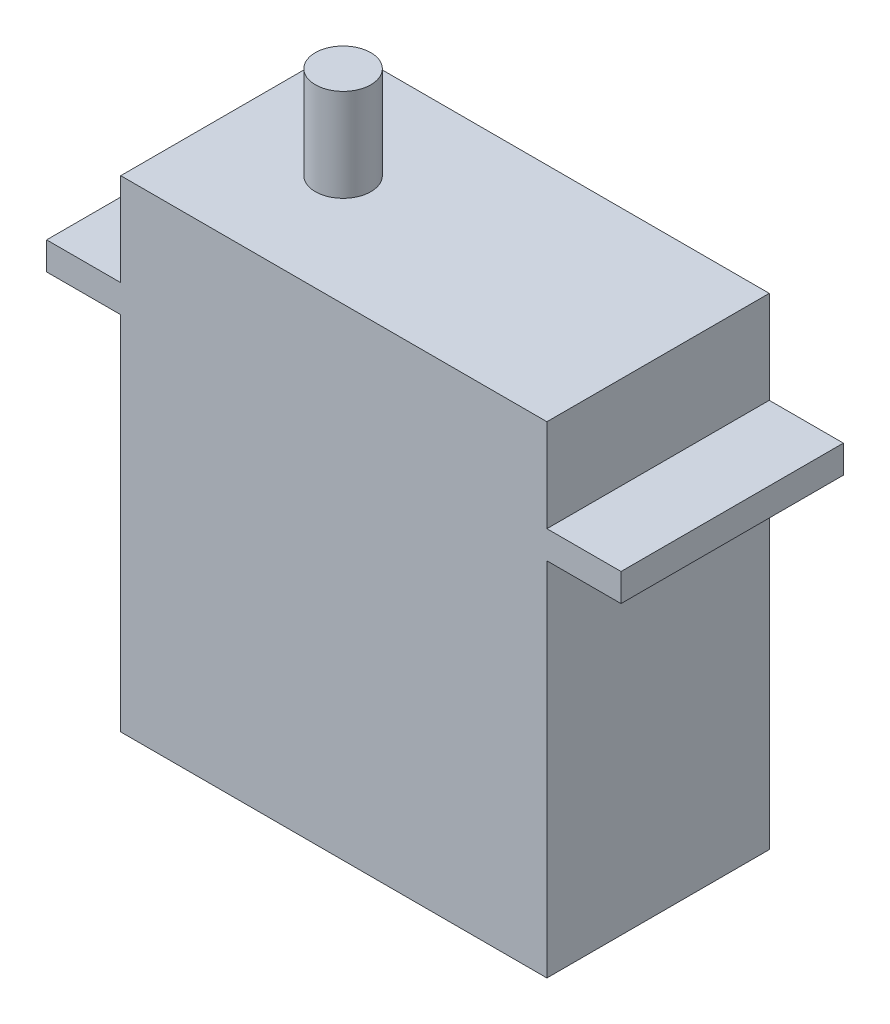
ISO-10303-21;
HEADER;
FILE_DESCRIPTION(('STEP AP214'),'2;1');
FILE_NAME('part.step','',(''),(''),'','','');
FILE_SCHEMA(('AUTOMOTIVE_DESIGN { 1 0 10303 214 1 1 1 1 }'));
ENDSEC;
DATA;
#1=APPLICATION_CONTEXT('core data for automotive mechanical design processes');
#2=APPLICATION_PROTOCOL_DEFINITION('international standard','automotive_design',2000,#1);
#3=PRODUCT_CONTEXT('',#1,'mechanical');
#4=PRODUCT('Part','Part','',(#3));
#5=PRODUCT_RELATED_PRODUCT_CATEGORY('part','',(#4));
#6=PRODUCT_DEFINITION_FORMATION('','',#4);
#7=PRODUCT_DEFINITION_CONTEXT('part definition',#1,'design');
#8=PRODUCT_DEFINITION('design','',#6,#7);
#9=PRODUCT_DEFINITION_SHAPE('','',#8);
#10=(LENGTH_UNIT() NAMED_UNIT(*) SI_UNIT(.MILLI.,.METRE.));
#11=(NAMED_UNIT(*) PLANE_ANGLE_UNIT() SI_UNIT($,.RADIAN.));
#12=(NAMED_UNIT(*) SI_UNIT($,.STERADIAN.) SOLID_ANGLE_UNIT());
#13=UNCERTAINTY_MEASURE_WITH_UNIT(LENGTH_MEASURE(1.E-05),#10,'distance_accuracy_value','');
#14=(GEOMETRIC_REPRESENTATION_CONTEXT(3) GLOBAL_UNCERTAINTY_ASSIGNED_CONTEXT((#13)) GLOBAL_UNIT_ASSIGNED_CONTEXT((#10,
#11,#12)) REPRESENTATION_CONTEXT('',''));
#15=CARTESIAN_POINT('',(0.,0.,0.));
#16=DIRECTION('',(0.,0.,1.));
#17=DIRECTION('',(1.,0.,0.));
#18=AXIS2_PLACEMENT_3D('',#15,#16,#17);
#19=CARTESIAN_POINT('',(-11.5,26.,-6.));
#20=DIRECTION('',(1.,0.,0.));
#21=DIRECTION('',(0.,0.,-1.));
#22=AXIS2_PLACEMENT_3D('',#19,#20,#21);
#23=PLANE('',#22);
#24=DIRECTION('',(0.,-1.,0.));
#25=VECTOR('',#24,1.);
#26=CARTESIAN_POINT('',(-11.5,26.,6.));
#27=LINE('',#26,#25);
#28=CARTESIAN_POINT('',(-11.5,19.5,6.));
#29=VERTEX_POINT('',#28);
#30=CARTESIAN_POINT('',(-11.5,0.,6.));
#31=VERTEX_POINT('',#30);
#32=EDGE_CURVE('E208',#29,#31,#27,.T.);
#33=ORIENTED_EDGE('',*,*,#32,.F.);
#34=DIRECTION('',(0.,0.,-1.));
#35=VECTOR('',#34,1.);
#36=CARTESIAN_POINT('',(-11.5,19.5,6.));
#37=LINE('',#36,#35);
#38=CARTESIAN_POINT('',(-11.5,19.5,-6.));
#39=VERTEX_POINT('',#38);
#40=EDGE_CURVE('E141',#29,#39,#37,.T.);
#41=ORIENTED_EDGE('',*,*,#40,.T.);
#42=DIRECTION('',(0.,-1.,0.));
#43=VECTOR('',#42,1.);
#44=CARTESIAN_POINT('',(-11.5,26.,-6.));
#45=LINE('',#44,#43);
#46=CARTESIAN_POINT('',(-11.5,0.,-6.));
#47=VERTEX_POINT('',#46);
#48=EDGE_CURVE('E209',#39,#47,#45,.T.);
#49=ORIENTED_EDGE('',*,*,#48,.T.);
#50=DIRECTION('',(0.,0.,1.));
#51=VECTOR('',#50,1.);
#52=CARTESIAN_POINT('',(-11.5,0.,-6.));
#53=LINE('',#52,#51);
#54=EDGE_CURVE('E202',#47,#31,#53,.T.);
#55=ORIENTED_EDGE('',*,*,#54,.T.);
#56=EDGE_LOOP('',(#33,#41,#49,#55));
#57=FACE_BOUND('',#56,.T.);
#58=ADVANCED_FACE('F33',(#57),#23,.F.);
#59=CARTESIAN_POINT('',(11.5,26.,-6.));
#60=DIRECTION('',(-1.,0.,0.));
#61=DIRECTION('',(0.,0.,1.));
#62=AXIS2_PLACEMENT_3D('',#59,#60,#61);
#63=PLANE('',#62);
#64=DIRECTION('',(0.,0.,1.));
#65=VECTOR('',#64,1.);
#66=CARTESIAN_POINT('',(11.5,21.,6.));
#67=LINE('',#66,#65);
#68=CARTESIAN_POINT('',(11.5,21.,-6.));
#69=VERTEX_POINT('',#68);
#70=CARTESIAN_POINT('',(11.5,21.,6.));
#71=VERTEX_POINT('',#70);
#72=EDGE_CURVE('E164',#69,#71,#67,.T.);
#73=ORIENTED_EDGE('',*,*,#72,.F.);
#74=DIRECTION('',(0.,-1.,0.));
#75=VECTOR('',#74,1.);
#76=CARTESIAN_POINT('',(11.5,26.,-6.));
#77=LINE('',#76,#75);
#78=CARTESIAN_POINT('',(11.5,26.,-6.));
#79=VERTEX_POINT('',#78);
#80=EDGE_CURVE('E11',#79,#69,#77,.T.);
#81=ORIENTED_EDGE('',*,*,#80,.F.);
#82=DIRECTION('',(0.,0.,-1.));
#83=VECTOR('',#82,1.);
#84=CARTESIAN_POINT('',(11.5,26.,-6.));
#85=LINE('',#84,#83);
#86=CARTESIAN_POINT('',(11.5,26.,6.));
#87=VERTEX_POINT('',#86);
#88=EDGE_CURVE('E186',#87,#79,#85,.T.);
#89=ORIENTED_EDGE('',*,*,#88,.F.);
#90=DIRECTION('',(0.,-1.,0.));
#91=VECTOR('',#90,1.);
#92=CARTESIAN_POINT('',(11.5,26.,6.));
#93=LINE('',#92,#91);
#94=EDGE_CURVE('E206',#87,#71,#93,.T.);
#95=ORIENTED_EDGE('',*,*,#94,.T.);
#96=EDGE_LOOP('',(#73,#81,#89,#95));
#97=FACE_BOUND('',#96,.T.);
#98=ADVANCED_FACE('F35',(#97),#63,.F.);
#99=DIRECTION('',(0.,0.,-1.));
#100=VECTOR('',#99,1.);
#101=CARTESIAN_POINT('',(11.5,19.5,6.));
#102=LINE('',#101,#100);
#103=CARTESIAN_POINT('',(11.5,19.5,6.));
#104=VERTEX_POINT('',#103);
#105=CARTESIAN_POINT('',(11.5,19.5,-6.));
#106=VERTEX_POINT('',#105);
#107=EDGE_CURVE('E56',#104,#106,#102,.T.);
#108=ORIENTED_EDGE('',*,*,#107,.F.);
#109=CARTESIAN_POINT('',(11.5,0.,6.));
#110=VERTEX_POINT('',#109);
#111=EDGE_CURVE('E196',#104,#110,#93,.T.);
#112=ORIENTED_EDGE('',*,*,#111,.T.);
#113=DIRECTION('',(0.,0.,-1.));
#114=VECTOR('',#113,1.);
#115=CARTESIAN_POINT('',(11.5,0.,-6.));
#116=LINE('',#115,#114);
#117=CARTESIAN_POINT('',(11.5,0.,-6.));
#118=VERTEX_POINT('',#117);
#119=EDGE_CURVE('E185',#110,#118,#116,.T.);
#120=ORIENTED_EDGE('',*,*,#119,.T.);
#121=EDGE_CURVE('E41',#106,#118,#77,.T.);
#122=ORIENTED_EDGE('',*,*,#121,.F.);
#123=EDGE_LOOP('',(#108,#112,#120,#122));
#124=FACE_BOUND('',#123,.T.);
#125=ADVANCED_FACE('F263',(#124),#63,.F.);
#126=CARTESIAN_POINT('',(-11.5,26.,-6.));
#127=DIRECTION('',(0.,0.,1.));
#128=DIRECTION('',(1.,0.,0.));
#129=AXIS2_PLACEMENT_3D('',#126,#127,#128);
#130=PLANE('',#129);
#131=DIRECTION('',(-1.,0.,0.));
#132=VECTOR('',#131,1.);
#133=CARTESIAN_POINT('',(-11.5,0.,-6.));
#134=LINE('',#133,#132);
#135=EDGE_CURVE('E199',#118,#47,#134,.T.);
#136=ORIENTED_EDGE('',*,*,#135,.T.);
#137=ORIENTED_EDGE('',*,*,#48,.F.);
#138=DIRECTION('',(1.,0.,0.));
#139=VECTOR('',#138,1.);
#140=CARTESIAN_POINT('',(-15.5,19.5,-6.));
#141=LINE('',#140,#139);
#142=CARTESIAN_POINT('',(-15.5,19.5,-6.));
#143=VERTEX_POINT('',#142);
#144=EDGE_CURVE('E157',#143,#39,#141,.T.);
#145=ORIENTED_EDGE('',*,*,#144,.F.);
#146=DIRECTION('',(0.,1.,0.));
#147=VECTOR('',#146,1.);
#148=CARTESIAN_POINT('',(-15.5,21.,-6.));
#149=LINE('',#148,#147);
#150=CARTESIAN_POINT('',(-15.5,21.,-6.));
#151=VERTEX_POINT('',#150);
#152=EDGE_CURVE('E144',#143,#151,#149,.T.);
#153=ORIENTED_EDGE('',*,*,#152,.T.);
#154=DIRECTION('',(1.,0.,0.));
#155=VECTOR('',#154,1.);
#156=CARTESIAN_POINT('',(-15.5,21.,-6.));
#157=LINE('',#156,#155);
#158=CARTESIAN_POINT('',(-11.5,21.,-6.));
#159=VERTEX_POINT('',#158);
#160=EDGE_CURVE('E131',#151,#159,#157,.T.);
#161=ORIENTED_EDGE('',*,*,#160,.T.);
#162=CARTESIAN_POINT('',(-11.5,26.,-6.));
#163=VERTEX_POINT('',#162);
#164=EDGE_CURVE('E210',#163,#159,#45,.T.);
#165=ORIENTED_EDGE('',*,*,#164,.F.);
#166=DIRECTION('',(-1.,0.,0.));
#167=VECTOR('',#166,1.);
#168=CARTESIAN_POINT('',(-11.5,26.,-6.));
#169=LINE('',#168,#167);
#170=EDGE_CURVE('E189',#79,#163,#169,.T.);
#171=ORIENTED_EDGE('',*,*,#170,.F.);
#172=ORIENTED_EDGE('',*,*,#80,.T.);
#173=DIRECTION('',(-1.,0.,0.));
#174=VECTOR('',#173,1.);
#175=CARTESIAN_POINT('',(15.5,21.,-6.));
#176=LINE('',#175,#174);
#177=CARTESIAN_POINT('',(15.5,21.,-6.));
#178=VERTEX_POINT('',#177);
#179=EDGE_CURVE('E176',#178,#69,#176,.T.);
#180=ORIENTED_EDGE('',*,*,#179,.F.);
#181=DIRECTION('',(0.,1.,0.));
#182=VECTOR('',#181,1.);
#183=CARTESIAN_POINT('',(15.5,21.,-6.));
#184=LINE('',#183,#182);
#185=CARTESIAN_POINT('',(15.5,19.5,-6.));
#186=VERTEX_POINT('',#185);
#187=EDGE_CURVE('E166',#186,#178,#184,.T.);
#188=ORIENTED_EDGE('',*,*,#187,.F.);
#189=DIRECTION('',(-1.,0.,0.));
#190=VECTOR('',#189,1.);
#191=CARTESIAN_POINT('',(15.5,19.5,-6.));
#192=LINE('',#191,#190);
#193=EDGE_CURVE('E179',#186,#106,#192,.T.);
#194=ORIENTED_EDGE('',*,*,#193,.T.);
#195=ORIENTED_EDGE('',*,*,#121,.T.);
#196=EDGE_LOOP('',(#136,#137,#145,#153,#161,#165,#171,#172,#180,#188,#194,#195));
#197=FACE_BOUND('',#196,.T.);
#198=ADVANCED_FACE('F223',(#197),#130,.F.);
#199=ORIENTED_EDGE('',*,*,#164,.T.);
#200=DIRECTION('',(0.,0.,1.));
#201=VECTOR('',#200,1.);
#202=CARTESIAN_POINT('',(-11.5,21.,6.));
#203=LINE('',#202,#201);
#204=CARTESIAN_POINT('',(-11.5,21.,6.));
#205=VERTEX_POINT('',#204);
#206=EDGE_CURVE('E151',#159,#205,#203,.T.);
#207=ORIENTED_EDGE('',*,*,#206,.T.);
#208=CARTESIAN_POINT('',(-11.5,26.,6.));
#209=VERTEX_POINT('',#208);
#210=EDGE_CURVE('E130',#209,#205,#27,.T.);
#211=ORIENTED_EDGE('',*,*,#210,.F.);
#212=DIRECTION('',(0.,0.,1.));
#213=VECTOR('',#212,1.);
#214=CARTESIAN_POINT('',(-11.5,26.,-6.));
#215=LINE('',#214,#213);
#216=EDGE_CURVE('E192',#163,#209,#215,.T.);
#217=ORIENTED_EDGE('',*,*,#216,.F.);
#218=EDGE_LOOP('',(#199,#207,#211,#217));
#219=FACE_BOUND('',#218,.T.);
#220=ADVANCED_FACE('F230',(#219),#23,.F.);
#221=CARTESIAN_POINT('',(-11.5,26.,6.));
#222=DIRECTION('',(0.,0.,-1.));
#223=DIRECTION('',(-1.,0.,0.));
#224=AXIS2_PLACEMENT_3D('',#221,#222,#223);
#225=PLANE('',#224);
#226=DIRECTION('',(1.,0.,0.));
#227=VECTOR('',#226,1.);
#228=CARTESIAN_POINT('',(-11.5,0.,6.));
#229=LINE('',#228,#227);
#230=EDGE_CURVE('E190',#31,#110,#229,.T.);
#231=ORIENTED_EDGE('',*,*,#230,.T.);
#232=ORIENTED_EDGE('',*,*,#111,.F.);
#233=DIRECTION('',(-1.,0.,0.));
#234=VECTOR('',#233,1.);
#235=CARTESIAN_POINT('',(15.5,19.5,6.));
#236=LINE('',#235,#234);
#237=CARTESIAN_POINT('',(15.5,19.5,6.));
#238=VERTEX_POINT('',#237);
#239=EDGE_CURVE('E182',#238,#104,#236,.T.);
#240=ORIENTED_EDGE('',*,*,#239,.F.);
#241=DIRECTION('',(0.,-1.,0.));
#242=VECTOR('',#241,1.);
#243=CARTESIAN_POINT('',(15.5,21.,6.));
#244=LINE('',#243,#242);
#245=CARTESIAN_POINT('',(15.5,21.,6.));
#246=VERTEX_POINT('',#245);
#247=EDGE_CURVE('E160',#246,#238,#244,.T.);
#248=ORIENTED_EDGE('',*,*,#247,.F.);
#249=DIRECTION('',(-1.,0.,0.));
#250=VECTOR('',#249,1.);
#251=CARTESIAN_POINT('',(15.5,21.,6.));
#252=LINE('',#251,#250);
#253=EDGE_CURVE('E170',#246,#71,#252,.T.);
#254=ORIENTED_EDGE('',*,*,#253,.T.);
#255=ORIENTED_EDGE('',*,*,#94,.F.);
#256=DIRECTION('',(1.,0.,0.));
#257=VECTOR('',#256,1.);
#258=CARTESIAN_POINT('',(-11.5,26.,6.));
#259=LINE('',#258,#257);
#260=EDGE_CURVE('E194',#209,#87,#259,.T.);
#261=ORIENTED_EDGE('',*,*,#260,.F.);
#262=ORIENTED_EDGE('',*,*,#210,.T.);
#263=DIRECTION('',(1.,0.,0.));
#264=VECTOR('',#263,1.);
#265=CARTESIAN_POINT('',(-15.5,21.,6.));
#266=LINE('',#265,#264);
#267=CARTESIAN_POINT('',(-15.5,21.,6.));
#268=VERTEX_POINT('',#267);
#269=EDGE_CURVE('E48',#268,#205,#266,.T.);
#270=ORIENTED_EDGE('',*,*,#269,.F.);
#271=DIRECTION('',(0.,-1.,0.));
#272=VECTOR('',#271,1.);
#273=CARTESIAN_POINT('',(-15.5,21.,6.));
#274=LINE('',#273,#272);
#275=CARTESIAN_POINT('',(-15.5,19.5,6.));
#276=VERTEX_POINT('',#275);
#277=EDGE_CURVE('E126',#268,#276,#274,.T.);
#278=ORIENTED_EDGE('',*,*,#277,.T.);
#279=DIRECTION('',(1.,0.,0.));
#280=VECTOR('',#279,1.);
#281=CARTESIAN_POINT('',(-15.5,19.5,6.));
#282=LINE('',#281,#280);
#283=EDGE_CURVE('E150',#276,#29,#282,.T.);
#284=ORIENTED_EDGE('',*,*,#283,.T.);
#285=ORIENTED_EDGE('',*,*,#32,.T.);
#286=EDGE_LOOP('',(#231,#232,#240,#248,#254,#255,#261,#262,#270,#278,#284,#285));
#287=FACE_BOUND('',#286,.T.);
#288=ADVANCED_FACE('F125',(#287),#225,.F.);
#289=CARTESIAN_POINT('',(0.,26.,0.));
#290=DIRECTION('',(0.,1.,0.));
#291=DIRECTION('',(0.,0.,1.));
#292=AXIS2_PLACEMENT_3D('',#289,#290,#291);
#293=PLANE('',#292);
#294=CARTESIAN_POINT('',(-5.5,26.,0.));
#295=DIRECTION('',(0.,1.,0.));
#296=DIRECTION('',(0.,0.,1.));
#297=AXIS2_PLACEMENT_3D('',#294,#295,#296);
#298=CIRCLE('',#297,1.5);
#299=CARTESIAN_POINT('',(-5.5,26.,1.5));
#300=VERTEX_POINT('',#299);
#301=EDGE_CURVE('E391',#300,#300,#298,.T.);
#302=ORIENTED_EDGE('',*,*,#301,.F.);
#303=EDGE_LOOP('',(#302));
#304=FACE_BOUND('',#303,.T.);
#305=ORIENTED_EDGE('',*,*,#88,.T.);
#306=ORIENTED_EDGE('',*,*,#170,.T.);
#307=ORIENTED_EDGE('',*,*,#216,.T.);
#308=ORIENTED_EDGE('',*,*,#260,.T.);
#309=EDGE_LOOP('',(#305,#306,#307,#308));
#310=FACE_BOUND('',#309,.T.);
#311=ADVANCED_FACE('F234',(#304,#310),#293,.T.);
#312=CARTESIAN_POINT('',(0.,0.,0.));
#313=DIRECTION('',(0.,1.,0.));
#314=DIRECTION('',(0.,0.,1.));
#315=AXIS2_PLACEMENT_3D('',#312,#313,#314);
#316=PLANE('',#315);
#317=ORIENTED_EDGE('',*,*,#119,.F.);
#318=ORIENTED_EDGE('',*,*,#230,.F.);
#319=ORIENTED_EDGE('',*,*,#54,.F.);
#320=ORIENTED_EDGE('',*,*,#135,.F.);
#321=EDGE_LOOP('',(#317,#318,#319,#320));
#322=FACE_BOUND('',#321,.T.);
#323=ADVANCED_FACE('F226',(#322),#316,.F.);
#324=CARTESIAN_POINT('',(15.5,19.5,6.));
#325=DIRECTION('',(0.,1.,0.));
#326=DIRECTION('',(0.,0.,1.));
#327=AXIS2_PLACEMENT_3D('',#324,#325,#326);
#328=PLANE('',#327);
#329=ORIENTED_EDGE('',*,*,#107,.T.);
#330=ORIENTED_EDGE('',*,*,#193,.F.);
#331=DIRECTION('',(0.,0.,-1.));
#332=VECTOR('',#331,1.);
#333=CARTESIAN_POINT('',(15.5,19.5,6.));
#334=LINE('',#333,#332);
#335=EDGE_CURVE('E163',#238,#186,#334,.T.);
#336=ORIENTED_EDGE('',*,*,#335,.F.);
#337=ORIENTED_EDGE('',*,*,#239,.T.);
#338=EDGE_LOOP('',(#329,#330,#336,#337));
#339=FACE_BOUND('',#338,.T.);
#340=ADVANCED_FACE('F248',(#339),#328,.F.);
#341=CARTESIAN_POINT('',(15.5,21.,6.));
#342=DIRECTION('',(0.,-1.,0.));
#343=DIRECTION('',(0.,0.,-1.));
#344=AXIS2_PLACEMENT_3D('',#341,#342,#343);
#345=PLANE('',#344);
#346=ORIENTED_EDGE('',*,*,#72,.T.);
#347=ORIENTED_EDGE('',*,*,#253,.F.);
#348=DIRECTION('',(0.,0.,1.));
#349=VECTOR('',#348,1.);
#350=CARTESIAN_POINT('',(15.5,21.,6.));
#351=LINE('',#350,#349);
#352=EDGE_CURVE('E168',#178,#246,#351,.T.);
#353=ORIENTED_EDGE('',*,*,#352,.F.);
#354=ORIENTED_EDGE('',*,*,#179,.T.);
#355=EDGE_LOOP('',(#346,#347,#353,#354));
#356=FACE_BOUND('',#355,.T.);
#357=ADVANCED_FACE('F241',(#356),#345,.F.);
#358=CARTESIAN_POINT('',(15.5,0.,0.));
#359=DIRECTION('',(1.,0.,0.));
#360=DIRECTION('',(0.,0.,-1.));
#361=AXIS2_PLACEMENT_3D('',#358,#359,#360);
#362=PLANE('',#361);
#363=ORIENTED_EDGE('',*,*,#247,.T.);
#364=ORIENTED_EDGE('',*,*,#335,.T.);
#365=ORIENTED_EDGE('',*,*,#187,.T.);
#366=ORIENTED_EDGE('',*,*,#352,.T.);
#367=EDGE_LOOP('',(#363,#364,#365,#366));
#368=FACE_BOUND('',#367,.T.);
#369=ADVANCED_FACE('F245',(#368),#362,.T.);
#370=CARTESIAN_POINT('',(-15.5,21.,6.));
#371=DIRECTION('',(0.,1.,0.));
#372=DIRECTION('',(0.,0.,1.));
#373=AXIS2_PLACEMENT_3D('',#370,#371,#372);
#374=PLANE('',#373);
#375=ORIENTED_EDGE('',*,*,#206,.F.);
#376=ORIENTED_EDGE('',*,*,#160,.F.);
#377=DIRECTION('',(0.,0.,1.));
#378=VECTOR('',#377,1.);
#379=CARTESIAN_POINT('',(-15.5,21.,6.));
#380=LINE('',#379,#378);
#381=EDGE_CURVE('E137',#151,#268,#380,.T.);
#382=ORIENTED_EDGE('',*,*,#381,.T.);
#383=ORIENTED_EDGE('',*,*,#269,.T.);
#384=EDGE_LOOP('',(#375,#376,#382,#383));
#385=FACE_BOUND('',#384,.T.);
#386=ADVANCED_FACE('F143',(#385),#374,.T.);
#387=CARTESIAN_POINT('',(-15.5,19.5,6.));
#388=DIRECTION('',(0.,-1.,0.));
#389=DIRECTION('',(0.,0.,-1.));
#390=AXIS2_PLACEMENT_3D('',#387,#388,#389);
#391=PLANE('',#390);
#392=ORIENTED_EDGE('',*,*,#40,.F.);
#393=ORIENTED_EDGE('',*,*,#283,.F.);
#394=DIRECTION('',(0.,0.,-1.));
#395=VECTOR('',#394,1.);
#396=CARTESIAN_POINT('',(-15.5,19.5,6.));
#397=LINE('',#396,#395);
#398=EDGE_CURVE('E140',#276,#143,#397,.T.);
#399=ORIENTED_EDGE('',*,*,#398,.T.);
#400=ORIENTED_EDGE('',*,*,#144,.T.);
#401=EDGE_LOOP('',(#392,#393,#399,#400));
#402=FACE_BOUND('',#401,.T.);
#403=ADVANCED_FACE('F229',(#402),#391,.T.);
#404=CARTESIAN_POINT('',(-15.5,0.,0.));
#405=DIRECTION('',(-1.,0.,0.));
#406=DIRECTION('',(0.,0.,-1.));
#407=AXIS2_PLACEMENT_3D('',#404,#405,#406);
#408=PLANE('',#407);
#409=ORIENTED_EDGE('',*,*,#277,.F.);
#410=ORIENTED_EDGE('',*,*,#381,.F.);
#411=ORIENTED_EDGE('',*,*,#152,.F.);
#412=ORIENTED_EDGE('',*,*,#398,.F.);
#413=EDGE_LOOP('',(#409,#410,#411,#412));
#414=FACE_BOUND('',#413,.T.);
#415=ADVANCED_FACE('F135',(#414),#408,.T.);
#416=CARTESIAN_POINT('',(-5.5,31.,0.));
#417=DIRECTION('',(0.,-1.,0.));
#418=DIRECTION('',(0.,0.,-1.));
#419=AXIS2_PLACEMENT_3D('',#416,#417,#418);
#420=CYLINDRICAL_SURFACE('',#419,1.5);
#421=CARTESIAN_POINT('',(-5.5,31.,0.));
#422=DIRECTION('',(0.,1.,0.));
#423=DIRECTION('',(0.,0.,1.));
#424=AXIS2_PLACEMENT_3D('',#421,#422,#423);
#425=CIRCLE('',#424,1.5);
#426=CARTESIAN_POINT('',(-5.5,31.,1.5));
#427=VERTEX_POINT('',#426);
#428=EDGE_CURVE('E153',#427,#427,#425,.T.);
#429=ORIENTED_EDGE('',*,*,#428,.F.);
#430=EDGE_LOOP('',(#429));
#431=FACE_BOUND('',#430,.T.);
#432=ORIENTED_EDGE('',*,*,#301,.T.);
#433=EDGE_LOOP('',(#432));
#434=FACE_BOUND('',#433,.T.);
#435=ADVANCED_FACE('F328',(#431,#434),#420,.T.);
#436=CARTESIAN_POINT('',(-5.5,31.,0.));
#437=DIRECTION('',(0.,1.,0.));
#438=DIRECTION('',(0.,0.,1.));
#439=AXIS2_PLACEMENT_3D('',#436,#437,#438);
#440=PLANE('',#439);
#441=ORIENTED_EDGE('',*,*,#428,.T.);
#442=EDGE_LOOP('',(#441));
#443=FACE_BOUND('',#442,.T.);
#444=ADVANCED_FACE('F337',(#443),#440,.T.);
#445=CLOSED_SHELL('',(#58,#98,#125,#198,#220,#288,#311,#323,#340,#357,#369,#386,#403,#415,#435,#444));
#446=MANIFOLD_SOLID_BREP('B2',#445);
#447=ADVANCED_BREP_SHAPE_REPRESENTATION('',(#18,#446),#14);
#448=SHAPE_DEFINITION_REPRESENTATION(#9,#447);
ENDSEC;
END-ISO-10303-21;
